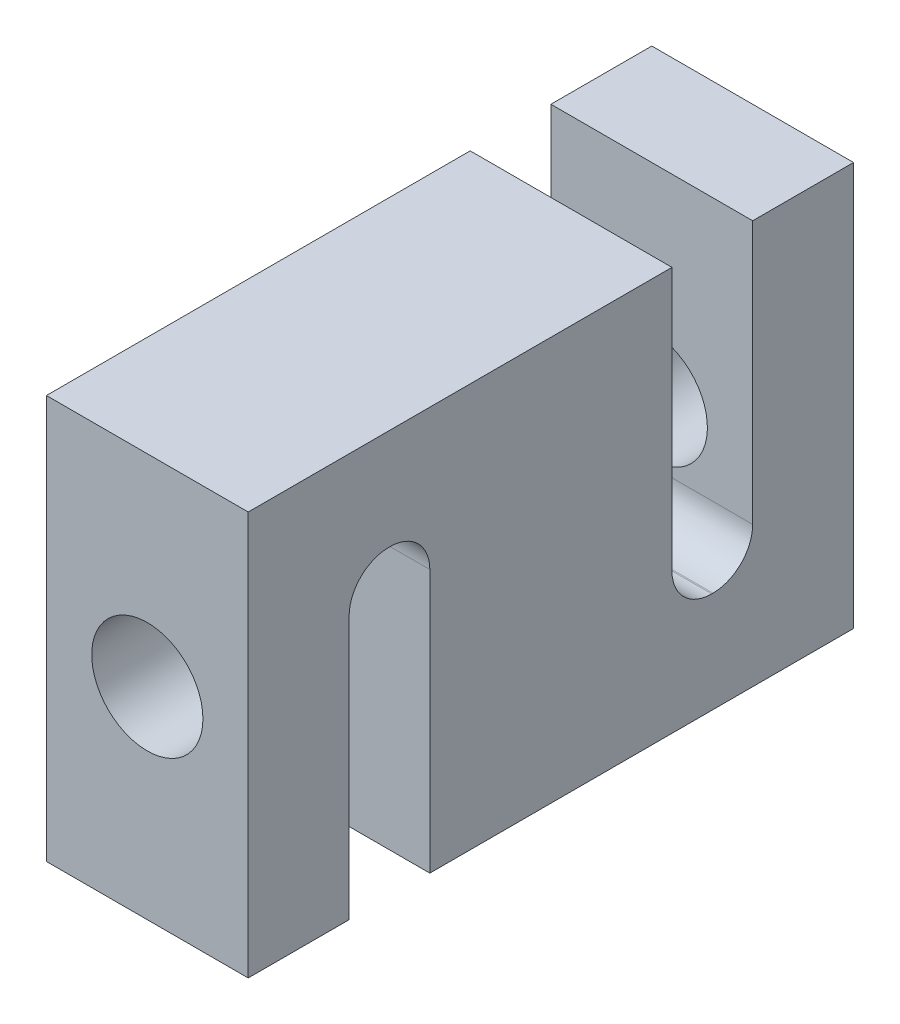
ISO-10303-21;
HEADER;
FILE_DESCRIPTION(('STEP AP214'),'2;1');
FILE_NAME('part.step','',(''),(''),'','','');
FILE_SCHEMA(('AUTOMOTIVE_DESIGN { 1 0 10303 214 1 1 1 1 }'));
ENDSEC;
DATA;
#1=APPLICATION_CONTEXT('core data for automotive mechanical design processes');
#2=APPLICATION_PROTOCOL_DEFINITION('international standard','automotive_design',2000,#1);
#3=PRODUCT_CONTEXT('',#1,'mechanical');
#4=PRODUCT('Part','Part','',(#3));
#5=PRODUCT_RELATED_PRODUCT_CATEGORY('part','',(#4));
#6=PRODUCT_DEFINITION_FORMATION('','',#4);
#7=PRODUCT_DEFINITION_CONTEXT('part definition',#1,'design');
#8=PRODUCT_DEFINITION('design','',#6,#7);
#9=PRODUCT_DEFINITION_SHAPE('','',#8);
#10=(LENGTH_UNIT() NAMED_UNIT(*) SI_UNIT(.MILLI.,.METRE.));
#11=(NAMED_UNIT(*) PLANE_ANGLE_UNIT() SI_UNIT($,.RADIAN.));
#12=(NAMED_UNIT(*) SI_UNIT($,.STERADIAN.) SOLID_ANGLE_UNIT());
#13=UNCERTAINTY_MEASURE_WITH_UNIT(LENGTH_MEASURE(1.E-05),#10,'distance_accuracy_value','');
#14=(GEOMETRIC_REPRESENTATION_CONTEXT(3) GLOBAL_UNCERTAINTY_ASSIGNED_CONTEXT((#13)) GLOBAL_UNIT_ASSIGNED_CONTEXT((#10,
#11,#12)) REPRESENTATION_CONTEXT('',''));
#15=CARTESIAN_POINT('',(0.,0.,0.));
#16=DIRECTION('',(0.,0.,1.));
#17=DIRECTION('',(1.,0.,0.));
#18=AXIS2_PLACEMENT_3D('',#15,#16,#17);
#19=CARTESIAN_POINT('',(0.,0.,76.2));
#20=DIRECTION('',(0.,0.,-1.));
#21=DIRECTION('',(-1.,0.,0.));
#22=AXIS2_PLACEMENT_3D('',#19,#20,#21);
#23=PLANE('',#22);
#24=DIRECTION('',(0.,-1.,0.));
#25=VECTOR('',#24,1.);
#26=CARTESIAN_POINT('',(-15.0442260230648,30.1202688679325,76.2));
#27=LINE('',#26,#25);
#28=CARTESIAN_POINT('',(-15.0442260230648,80.9202688679325,76.2));
#29=VERTEX_POINT('',#28);
#30=CARTESIAN_POINT('',(-15.0442260230648,30.1202688679325,76.2));
#31=VERTEX_POINT('',#30);
#32=EDGE_CURVE('E249',#29,#31,#27,.T.);
#33=ORIENTED_EDGE('',*,*,#32,.T.);
#34=DIRECTION('',(1.,0.,0.));
#35=VECTOR('',#34,1.);
#36=CARTESIAN_POINT('',(-15.0442260230648,30.1202688679325,76.2));
#37=LINE('',#36,#35);
#38=CARTESIAN_POINT('',(10.3557739769352,30.1202688679325,76.2));
#39=VERTEX_POINT('',#38);
#40=EDGE_CURVE('E252',#31,#39,#37,.T.);
#41=ORIENTED_EDGE('',*,*,#40,.T.);
#42=DIRECTION('',(0.,1.,0.));
#43=VECTOR('',#42,1.);
#44=CARTESIAN_POINT('',(10.3557739769352,30.1202688679325,76.2));
#45=LINE('',#44,#43);
#46=CARTESIAN_POINT('',(10.3557739769352,80.9202688679325,76.2));
#47=VERTEX_POINT('',#46);
#48=EDGE_CURVE('E255',#39,#47,#45,.T.);
#49=ORIENTED_EDGE('',*,*,#48,.T.);
#50=DIRECTION('',(-1.,0.,0.));
#51=VECTOR('',#50,1.);
#52=CARTESIAN_POINT('',(-15.0442260230648,80.9202688679325,76.2));
#53=LINE('',#52,#51);
#54=EDGE_CURVE('E177',#47,#29,#53,.T.);
#55=ORIENTED_EDGE('',*,*,#54,.T.);
#56=EDGE_LOOP('',(#33,#41,#49,#55));
#57=FACE_BOUND('',#56,.T.);
#58=CARTESIAN_POINT('',(-2.34422602306477,55.5202688679325,76.2));
#59=DIRECTION('',(0.,0.,1.));
#60=DIRECTION('',(1.,0.,0.));
#61=AXIS2_PLACEMENT_3D('',#58,#59,#60);
#62=CIRCLE('',#61,7.);
#63=CARTESIAN_POINT('',(4.65577397693523,55.5202688679325,76.2));
#64=VERTEX_POINT('',#63);
#65=EDGE_CURVE('E501',#64,#64,#62,.T.);
#66=ORIENTED_EDGE('',*,*,#65,.F.);
#67=EDGE_LOOP('',(#66));
#68=FACE_BOUND('',#67,.T.);
#69=ADVANCED_FACE('F39',(#57,#68),#23,.F.);
#70=CARTESIAN_POINT('',(-15.0442260230648,30.1202688679325,76.2));
#71=DIRECTION('',(0.,1.,0.));
#72=DIRECTION('',(0.,0.,1.));
#73=AXIS2_PLACEMENT_3D('',#70,#71,#72);
#74=PLANE('',#73);
#75=DIRECTION('',(0.,0.,-1.));
#76=VECTOR('',#75,1.);
#77=CARTESIAN_POINT('',(10.3557739769352,30.1202688679325,76.2));
#78=LINE('',#77,#76);
#79=CARTESIAN_POINT('',(10.3557739769352,30.1202688679325,53.34));
#80=VERTEX_POINT('',#79);
#81=CARTESIAN_POINT('',(10.3557739769352,30.1202688679325,0.));
#82=VERTEX_POINT('',#81);
#83=EDGE_CURVE('E178',#80,#82,#78,.T.);
#84=ORIENTED_EDGE('',*,*,#83,.F.);
#85=DIRECTION('',(-1.,0.,0.));
#86=VECTOR('',#85,1.);
#87=CARTESIAN_POINT('',(10.3557739769352,30.1202688679325,53.34));
#88=LINE('',#87,#86);
#89=CARTESIAN_POINT('',(-15.0442260230648,30.1202688679325,53.34));
#90=VERTEX_POINT('',#89);
#91=EDGE_CURVE('E240',#80,#90,#88,.T.);
#92=ORIENTED_EDGE('',*,*,#91,.T.);
#93=DIRECTION('',(0.,0.,-1.));
#94=VECTOR('',#93,1.);
#95=CARTESIAN_POINT('',(-15.0442260230648,30.1202688679325,76.2));
#96=LINE('',#95,#94);
#97=CARTESIAN_POINT('',(-15.0442260230648,30.1202688679325,0.));
#98=VERTEX_POINT('',#97);
#99=EDGE_CURVE('E188',#90,#98,#96,.T.);
#100=ORIENTED_EDGE('',*,*,#99,.T.);
#101=DIRECTION('',(1.,0.,0.));
#102=VECTOR('',#101,1.);
#103=CARTESIAN_POINT('',(-15.0442260230648,30.1202688679325,0.));
#104=LINE('',#103,#102);
#105=EDGE_CURVE('E262',#98,#82,#104,.T.);
#106=ORIENTED_EDGE('',*,*,#105,.T.);
#107=EDGE_LOOP('',(#84,#92,#100,#106));
#108=FACE_BOUND('',#107,.T.);
#109=ADVANCED_FACE('F322',(#108),#74,.F.);
#110=CARTESIAN_POINT('',(-15.0442260230648,80.9202688679325,76.2));
#111=DIRECTION('',(0.,-1.,0.));
#112=DIRECTION('',(0.,0.,-1.));
#113=AXIS2_PLACEMENT_3D('',#110,#111,#112);
#114=PLANE('',#113);
#115=DIRECTION('',(0.,0.,-1.));
#116=VECTOR('',#115,1.);
#117=CARTESIAN_POINT('',(-15.0442260230648,80.9202688679325,76.2));
#118=LINE('',#117,#116);
#119=CARTESIAN_POINT('',(-15.0442260230648,80.9202688679325,12.7));
#120=VERTEX_POINT('',#119);
#121=CARTESIAN_POINT('',(-15.0442260230648,80.9202688679325,0.));
#122=VERTEX_POINT('',#121);
#123=EDGE_CURVE('E258',#120,#122,#118,.T.);
#124=ORIENTED_EDGE('',*,*,#123,.F.);
#125=DIRECTION('',(-1.,0.,0.));
#126=VECTOR('',#125,1.);
#127=CARTESIAN_POINT('',(10.3557739769352,80.9202688679325,12.7));
#128=LINE('',#127,#126);
#129=CARTESIAN_POINT('',(10.3557739769352,80.9202688679325,12.7));
#130=VERTEX_POINT('',#129);
#131=EDGE_CURVE('E174',#130,#120,#128,.T.);
#132=ORIENTED_EDGE('',*,*,#131,.F.);
#133=DIRECTION('',(0.,0.,-1.));
#134=VECTOR('',#133,1.);
#135=CARTESIAN_POINT('',(10.3557739769352,80.9202688679325,76.2));
#136=LINE('',#135,#134);
#137=CARTESIAN_POINT('',(10.3557739769352,80.9202688679325,0.));
#138=VERTEX_POINT('',#137);
#139=EDGE_CURVE('E179',#130,#138,#136,.T.);
#140=ORIENTED_EDGE('',*,*,#139,.T.);
#141=DIRECTION('',(-1.,0.,0.));
#142=VECTOR('',#141,1.);
#143=CARTESIAN_POINT('',(-15.0442260230648,80.9202688679325,0.));
#144=LINE('',#143,#142);
#145=EDGE_CURVE('E253',#138,#122,#144,.T.);
#146=ORIENTED_EDGE('',*,*,#145,.T.);
#147=EDGE_LOOP('',(#124,#132,#140,#146));
#148=FACE_BOUND('',#147,.T.);
#149=ADVANCED_FACE('F272',(#148),#114,.F.);
#150=CARTESIAN_POINT('',(-15.0442260230648,30.1202688679325,76.2));
#151=DIRECTION('',(1.,0.,0.));
#152=DIRECTION('',(0.,0.,-1.));
#153=AXIS2_PLACEMENT_3D('',#150,#151,#152);
#154=PLANE('',#153);
#155=DIRECTION('',(0.,0.,1.));
#156=VECTOR('',#155,1.);
#157=CARTESIAN_POINT('',(-15.0442260230648,42.8202688679325,12.7));
#158=LINE('',#157,#156);
#159=CARTESIAN_POINT('',(-15.0442260230648,42.8202688679325,17.7));
#160=VERTEX_POINT('',#159);
#161=CARTESIAN_POINT('',(-15.0442260230648,42.8202688679325,17.86));
#162=VERTEX_POINT('',#161);
#163=EDGE_CURVE('E483',#160,#162,#158,.T.);
#164=ORIENTED_EDGE('',*,*,#163,.F.);
#165=CARTESIAN_POINT('',(-15.0442260230648,47.8202688679325,17.7));
#166=DIRECTION('',(1.,0.,0.));
#167=DIRECTION('',(0.,0.,-1.));
#168=AXIS2_PLACEMENT_3D('',#165,#166,#167);
#169=CIRCLE('',#168,5.);
#170=CARTESIAN_POINT('',(-15.0442260230648,47.8202688679325,12.7));
#171=VERTEX_POINT('',#170);
#172=EDGE_CURVE('E210',#160,#171,#169,.T.);
#173=ORIENTED_EDGE('',*,*,#172,.T.);
#174=DIRECTION('',(0.,-1.,0.));
#175=VECTOR('',#174,1.);
#176=CARTESIAN_POINT('',(-15.0442260230648,80.9202688679325,12.7));
#177=LINE('',#176,#175);
#178=EDGE_CURVE('E280',#120,#171,#177,.T.);
#179=ORIENTED_EDGE('',*,*,#178,.F.);
#180=ORIENTED_EDGE('',*,*,#123,.T.);
#181=DIRECTION('',(0.,-1.,0.));
#182=VECTOR('',#181,1.);
#183=CARTESIAN_POINT('',(-15.0442260230648,30.1202688679325,0.));
#184=LINE('',#183,#182);
#185=EDGE_CURVE('E259',#122,#98,#184,.T.);
#186=ORIENTED_EDGE('',*,*,#185,.T.);
#187=ORIENTED_EDGE('',*,*,#99,.F.);
#188=DIRECTION('',(0.,-1.,0.));
#189=VECTOR('',#188,1.);
#190=CARTESIAN_POINT('',(-15.0442260230648,30.1202688679325,53.34));
#191=LINE('',#190,#189);
#192=CARTESIAN_POINT('',(-15.0442260230648,63.2202688679325,53.34));
#193=VERTEX_POINT('',#192);
#194=EDGE_CURVE('E228',#193,#90,#191,.T.);
#195=ORIENTED_EDGE('',*,*,#194,.F.);
#196=CARTESIAN_POINT('',(-15.0442260230648,63.2202688679325,58.34));
#197=DIRECTION('',(1.,0.,0.));
#198=DIRECTION('',(0.,0.,-1.));
#199=AXIS2_PLACEMENT_3D('',#196,#197,#198);
#200=CIRCLE('',#199,5.);
#201=CARTESIAN_POINT('',(-15.0442260230648,68.2202688679325,58.34));
#202=VERTEX_POINT('',#201);
#203=EDGE_CURVE('E47',#193,#202,#200,.T.);
#204=ORIENTED_EDGE('',*,*,#203,.T.);
#205=DIRECTION('',(0.,0.,-1.));
#206=VECTOR('',#205,1.);
#207=CARTESIAN_POINT('',(-15.0442260230648,68.2202688679325,53.34));
#208=LINE('',#207,#206);
#209=CARTESIAN_POINT('',(-15.0442260230648,68.2202688679325,58.5));
#210=VERTEX_POINT('',#209);
#211=EDGE_CURVE('E226',#210,#202,#208,.T.);
#212=ORIENTED_EDGE('',*,*,#211,.F.);
#213=CARTESIAN_POINT('',(-15.0442260230648,63.2202688679325,58.5));
#214=DIRECTION('',(1.,0.,0.));
#215=DIRECTION('',(0.,0.,-1.));
#216=AXIS2_PLACEMENT_3D('',#213,#214,#215);
#217=CIRCLE('',#216,5.);
#218=CARTESIAN_POINT('',(-15.0442260230648,63.2202688679325,63.5));
#219=VERTEX_POINT('',#218);
#220=EDGE_CURVE('E217',#210,#219,#217,.T.);
#221=ORIENTED_EDGE('',*,*,#220,.T.);
#222=DIRECTION('',(0.,1.,0.));
#223=VECTOR('',#222,1.);
#224=CARTESIAN_POINT('',(-15.0442260230648,30.1202688679325,63.5));
#225=LINE('',#224,#223);
#226=CARTESIAN_POINT('',(-15.0442260230648,30.1202688679325,63.5));
#227=VERTEX_POINT('',#226);
#228=EDGE_CURVE('E233',#227,#219,#225,.T.);
#229=ORIENTED_EDGE('',*,*,#228,.F.);
#230=EDGE_CURVE('E189',#31,#227,#96,.T.);
#231=ORIENTED_EDGE('',*,*,#230,.F.);
#232=ORIENTED_EDGE('',*,*,#32,.F.);
#233=CARTESIAN_POINT('',(-15.0442260230648,80.9202688679325,22.86));
#234=VERTEX_POINT('',#233);
#235=EDGE_CURVE('E183',#29,#234,#118,.T.);
#236=ORIENTED_EDGE('',*,*,#235,.T.);
#237=DIRECTION('',(0.,1.,0.));
#238=VECTOR('',#237,1.);
#239=CARTESIAN_POINT('',(-15.0442260230648,80.9202688679325,22.86));
#240=LINE('',#239,#238);
#241=CARTESIAN_POINT('',(-15.0442260230648,47.8202688679325,22.86));
#242=VERTEX_POINT('',#241);
#243=EDGE_CURVE('E170',#242,#234,#240,.T.);
#244=ORIENTED_EDGE('',*,*,#243,.F.);
#245=CARTESIAN_POINT('',(-15.0442260230648,47.8202688679325,17.86));
#246=DIRECTION('',(1.,0.,0.));
#247=DIRECTION('',(0.,0.,-1.));
#248=AXIS2_PLACEMENT_3D('',#245,#246,#247);
#249=CIRCLE('',#248,5.);
#250=EDGE_CURVE('E214',#242,#162,#249,.T.);
#251=ORIENTED_EDGE('',*,*,#250,.T.);
#252=EDGE_LOOP('',(#164,#173,#179,#180,#186,#187,#195,#204,#212,#221,#229,#231,#232,#236,#244,#251));
#253=FACE_BOUND('',#252,.T.);
#254=ADVANCED_FACE('F225',(#253),#154,.F.);
#255=ORIENTED_EDGE('',*,*,#230,.T.);
#256=DIRECTION('',(-1.,0.,0.));
#257=VECTOR('',#256,1.);
#258=CARTESIAN_POINT('',(10.3557739769352,30.1202688679325,63.5));
#259=LINE('',#258,#257);
#260=CARTESIAN_POINT('',(10.3557739769352,30.1202688679325,63.5));
#261=VERTEX_POINT('',#260);
#262=EDGE_CURVE('E291',#261,#227,#259,.T.);
#263=ORIENTED_EDGE('',*,*,#262,.F.);
#264=EDGE_CURVE('E181',#39,#261,#78,.T.);
#265=ORIENTED_EDGE('',*,*,#264,.F.);
#266=ORIENTED_EDGE('',*,*,#40,.F.);
#267=EDGE_LOOP('',(#255,#263,#265,#266));
#268=FACE_BOUND('',#267,.T.);
#269=ADVANCED_FACE('F290',(#268),#74,.F.);
#270=CARTESIAN_POINT('',(10.3557739769352,30.1202688679325,76.2));
#271=DIRECTION('',(-1.,0.,0.));
#272=DIRECTION('',(0.,0.,1.));
#273=AXIS2_PLACEMENT_3D('',#270,#271,#272);
#274=PLANE('',#273);
#275=ORIENTED_EDGE('',*,*,#139,.F.);
#276=DIRECTION('',(0.,-1.,0.));
#277=VECTOR('',#276,1.);
#278=CARTESIAN_POINT('',(10.3557739769352,80.9202688679325,12.7));
#279=LINE('',#278,#277);
#280=CARTESIAN_POINT('',(10.3557739769352,47.8202688679325,12.7));
#281=VERTEX_POINT('',#280);
#282=EDGE_CURVE('E488',#130,#281,#279,.T.);
#283=ORIENTED_EDGE('',*,*,#282,.T.);
#284=CARTESIAN_POINT('',(10.3557739769352,47.8202688679325,17.7));
#285=DIRECTION('',(-1.,0.,0.));
#286=DIRECTION('',(0.,0.,1.));
#287=AXIS2_PLACEMENT_3D('',#284,#285,#286);
#288=CIRCLE('',#287,5.);
#289=CARTESIAN_POINT('',(10.3557739769352,42.8202688679325,17.7));
#290=VERTEX_POINT('',#289);
#291=EDGE_CURVE('E212',#281,#290,#288,.T.);
#292=ORIENTED_EDGE('',*,*,#291,.T.);
#293=DIRECTION('',(0.,0.,1.));
#294=VECTOR('',#293,1.);
#295=CARTESIAN_POINT('',(10.3557739769352,42.8202688679325,12.7));
#296=LINE('',#295,#294);
#297=CARTESIAN_POINT('',(10.3557739769352,42.8202688679325,17.86));
#298=VERTEX_POINT('',#297);
#299=EDGE_CURVE('E165',#290,#298,#296,.T.);
#300=ORIENTED_EDGE('',*,*,#299,.T.);
#301=CARTESIAN_POINT('',(10.3557739769352,47.8202688679325,17.86));
#302=DIRECTION('',(-1.,0.,0.));
#303=DIRECTION('',(0.,0.,1.));
#304=AXIS2_PLACEMENT_3D('',#301,#302,#303);
#305=CIRCLE('',#304,5.);
#306=CARTESIAN_POINT('',(10.3557739769352,47.8202688679325,22.86));
#307=VERTEX_POINT('',#306);
#308=EDGE_CURVE('E160',#298,#307,#305,.T.);
#309=ORIENTED_EDGE('',*,*,#308,.T.);
#310=DIRECTION('',(0.,1.,0.));
#311=VECTOR('',#310,1.);
#312=CARTESIAN_POINT('',(10.3557739769352,80.9202688679325,22.86));
#313=LINE('',#312,#311);
#314=CARTESIAN_POINT('',(10.3557739769352,80.9202688679325,22.86));
#315=VERTEX_POINT('',#314);
#316=EDGE_CURVE('E150',#307,#315,#313,.T.);
#317=ORIENTED_EDGE('',*,*,#316,.T.);
#318=EDGE_CURVE('E156',#47,#315,#136,.T.);
#319=ORIENTED_EDGE('',*,*,#318,.F.);
#320=ORIENTED_EDGE('',*,*,#48,.F.);
#321=ORIENTED_EDGE('',*,*,#264,.T.);
#322=DIRECTION('',(0.,1.,0.));
#323=VECTOR('',#322,1.);
#324=CARTESIAN_POINT('',(10.3557739769352,30.1202688679325,63.5));
#325=LINE('',#324,#323);
#326=CARTESIAN_POINT('',(10.3557739769352,63.2202688679325,63.5));
#327=VERTEX_POINT('',#326);
#328=EDGE_CURVE('E242',#261,#327,#325,.T.);
#329=ORIENTED_EDGE('',*,*,#328,.T.);
#330=CARTESIAN_POINT('',(10.3557739769352,63.2202688679325,58.5));
#331=DIRECTION('',(-1.,0.,0.));
#332=DIRECTION('',(0.,0.,1.));
#333=AXIS2_PLACEMENT_3D('',#330,#331,#332);
#334=CIRCLE('',#333,5.);
#335=CARTESIAN_POINT('',(10.3557739769352,68.2202688679325,58.5));
#336=VERTEX_POINT('',#335);
#337=EDGE_CURVE('E219',#327,#336,#334,.T.);
#338=ORIENTED_EDGE('',*,*,#337,.T.);
#339=DIRECTION('',(0.,0.,-1.));
#340=VECTOR('',#339,1.);
#341=CARTESIAN_POINT('',(10.3557739769352,68.2202688679325,53.34));
#342=LINE('',#341,#340);
#343=CARTESIAN_POINT('',(10.3557739769352,68.2202688679325,58.34));
#344=VERTEX_POINT('',#343);
#345=EDGE_CURVE('E245',#336,#344,#342,.T.);
#346=ORIENTED_EDGE('',*,*,#345,.T.);
#347=CARTESIAN_POINT('',(10.3557739769352,63.2202688679325,58.34));
#348=DIRECTION('',(-1.,0.,0.));
#349=DIRECTION('',(0.,0.,1.));
#350=AXIS2_PLACEMENT_3D('',#347,#348,#349);
#351=CIRCLE('',#350,5.);
#352=CARTESIAN_POINT('',(10.3557739769352,63.2202688679325,53.34));
#353=VERTEX_POINT('',#352);
#354=EDGE_CURVE('E11',#344,#353,#351,.T.);
#355=ORIENTED_EDGE('',*,*,#354,.T.);
#356=DIRECTION('',(0.,-1.,0.));
#357=VECTOR('',#356,1.);
#358=CARTESIAN_POINT('',(10.3557739769352,30.1202688679325,53.34));
#359=LINE('',#358,#357);
#360=EDGE_CURVE('E234',#353,#80,#359,.T.);
#361=ORIENTED_EDGE('',*,*,#360,.T.);
#362=ORIENTED_EDGE('',*,*,#83,.T.);
#363=DIRECTION('',(0.,1.,0.));
#364=VECTOR('',#363,1.);
#365=CARTESIAN_POINT('',(10.3557739769352,30.1202688679325,0.));
#366=LINE('',#365,#364);
#367=EDGE_CURVE('E265',#82,#138,#366,.T.);
#368=ORIENTED_EDGE('',*,*,#367,.T.);
#369=EDGE_LOOP('',(#275,#283,#292,#300,#309,#317,#319,#320,#321,#329,#338,#346,#355,#361,#362,#368));
#370=FACE_BOUND('',#369,.T.);
#371=ADVANCED_FACE('F153',(#370),#274,.F.);
#372=ORIENTED_EDGE('',*,*,#318,.T.);
#373=DIRECTION('',(-1.,0.,0.));
#374=VECTOR('',#373,1.);
#375=CARTESIAN_POINT('',(10.3557739769352,80.9202688679325,22.86));
#376=LINE('',#375,#374);
#377=EDGE_CURVE('E164',#315,#234,#376,.T.);
#378=ORIENTED_EDGE('',*,*,#377,.T.);
#379=ORIENTED_EDGE('',*,*,#235,.F.);
#380=ORIENTED_EDGE('',*,*,#54,.F.);
#381=EDGE_LOOP('',(#372,#378,#379,#380));
#382=FACE_BOUND('',#381,.T.);
#383=ADVANCED_FACE('F176',(#382),#114,.F.);
#384=CARTESIAN_POINT('',(0.,0.,0.));
#385=DIRECTION('',(0.,0.,-1.));
#386=DIRECTION('',(-1.,0.,0.));
#387=AXIS2_PLACEMENT_3D('',#384,#385,#386);
#388=PLANE('',#387);
#389=CARTESIAN_POINT('',(-2.34422602306477,55.5202688679325,0.));
#390=DIRECTION('',(0.,0.,-1.));
#391=DIRECTION('',(-1.,0.,0.));
#392=AXIS2_PLACEMENT_3D('',#389,#390,#391);
#393=CIRCLE('',#392,7.);
#394=CARTESIAN_POINT('',(-9.34422602306476,55.5202688679325,0.));
#395=VERTEX_POINT('',#394);
#396=EDGE_CURVE('E298',#395,#395,#393,.T.);
#397=ORIENTED_EDGE('',*,*,#396,.F.);
#398=EDGE_LOOP('',(#397));
#399=FACE_BOUND('',#398,.T.);
#400=ORIENTED_EDGE('',*,*,#185,.F.);
#401=ORIENTED_EDGE('',*,*,#145,.F.);
#402=ORIENTED_EDGE('',*,*,#367,.F.);
#403=ORIENTED_EDGE('',*,*,#105,.F.);
#404=EDGE_LOOP('',(#400,#401,#402,#403));
#405=FACE_BOUND('',#404,.T.);
#406=ADVANCED_FACE('F277',(#399,#405),#388,.T.);
#407=CARTESIAN_POINT('',(10.3557739769352,80.9202688679325,12.7));
#408=DIRECTION('',(0.,0.,-1.));
#409=DIRECTION('',(0.,1.,0.));
#410=AXIS2_PLACEMENT_3D('',#407,#408,#409);
#411=PLANE('',#410);
#412=CARTESIAN_POINT('',(-2.34422602306477,55.5202688679325,12.7));
#413=DIRECTION('',(0.,0.,-1.));
#414=DIRECTION('',(0.,1.,0.));
#415=AXIS2_PLACEMENT_3D('',#412,#413,#414);
#416=CIRCLE('',#415,7.);
#417=CARTESIAN_POINT('',(-2.34422602306477,62.5202688679325,12.7));
#418=VERTEX_POINT('',#417);
#419=EDGE_CURVE('E294',#418,#418,#416,.T.);
#420=ORIENTED_EDGE('',*,*,#419,.T.);
#421=EDGE_LOOP('',(#420));
#422=FACE_BOUND('',#421,.T.);
#423=ORIENTED_EDGE('',*,*,#178,.T.);
#424=DIRECTION('',(-1.,0.,0.));
#425=VECTOR('',#424,1.);
#426=CARTESIAN_POINT('',(10.3557739769352,47.8202688679325,12.7));
#427=LINE('',#426,#425);
#428=EDGE_CURVE('E197',#171,#281,#427,.F.);
#429=ORIENTED_EDGE('',*,*,#428,.T.);
#430=ORIENTED_EDGE('',*,*,#282,.F.);
#431=ORIENTED_EDGE('',*,*,#131,.T.);
#432=EDGE_LOOP('',(#423,#429,#430,#431));
#433=FACE_BOUND('',#432,.T.);
#434=ADVANCED_FACE('F333',(#422,#433),#411,.F.);
#435=CARTESIAN_POINT('',(10.3557739769352,80.9202688679325,22.86));
#436=DIRECTION('',(0.,0.,1.));
#437=DIRECTION('',(0.,-1.,0.));
#438=AXIS2_PLACEMENT_3D('',#435,#436,#437);
#439=PLANE('',#438);
#440=ORIENTED_EDGE('',*,*,#316,.F.);
#441=DIRECTION('',(-1.,0.,0.));
#442=VECTOR('',#441,1.);
#443=CARTESIAN_POINT('',(-15.0442260230648,47.8202688679325,22.86));
#444=LINE('',#443,#442);
#445=EDGE_CURVE('E199',#307,#242,#444,.T.);
#446=ORIENTED_EDGE('',*,*,#445,.T.);
#447=ORIENTED_EDGE('',*,*,#243,.T.);
#448=ORIENTED_EDGE('',*,*,#377,.F.);
#449=EDGE_LOOP('',(#440,#446,#447,#448));
#450=FACE_BOUND('',#449,.T.);
#451=ADVANCED_FACE('F168',(#450),#439,.F.);
#452=CARTESIAN_POINT('',(10.3557739769352,42.8202688679325,12.7));
#453=DIRECTION('',(0.,-1.,0.));
#454=DIRECTION('',(0.,0.,-1.));
#455=AXIS2_PLACEMENT_3D('',#452,#453,#454);
#456=PLANE('',#455);
#457=ORIENTED_EDGE('',*,*,#299,.F.);
#458=DIRECTION('',(-1.,0.,0.));
#459=VECTOR('',#458,1.);
#460=CARTESIAN_POINT('',(-15.0442260230648,42.8202688679325,17.7));
#461=LINE('',#460,#459);
#462=EDGE_CURVE('E194',#290,#160,#461,.T.);
#463=ORIENTED_EDGE('',*,*,#462,.T.);
#464=ORIENTED_EDGE('',*,*,#163,.T.);
#465=DIRECTION('',(-1.,0.,0.));
#466=VECTOR('',#465,1.);
#467=CARTESIAN_POINT('',(10.3557739769352,42.8202688679325,17.86));
#468=LINE('',#467,#466);
#469=EDGE_CURVE('E192',#162,#298,#468,.F.);
#470=ORIENTED_EDGE('',*,*,#469,.T.);
#471=EDGE_LOOP('',(#457,#463,#464,#470));
#472=FACE_BOUND('',#471,.T.);
#473=ADVANCED_FACE('F408',(#472),#456,.F.);
#474=CARTESIAN_POINT('',(10.3557739769352,30.1202688679325,53.34));
#475=DIRECTION('',(0.,0.,-1.));
#476=DIRECTION('',(-1.,0.,0.));
#477=AXIS2_PLACEMENT_3D('',#474,#475,#476);
#478=PLANE('',#477);
#479=ORIENTED_EDGE('',*,*,#360,.F.);
#480=DIRECTION('',(-1.,0.,0.));
#481=VECTOR('',#480,1.);
#482=CARTESIAN_POINT('',(-15.0442260230648,63.2202688679325,53.34));
#483=LINE('',#482,#481);
#484=EDGE_CURVE('E208',#353,#193,#483,.T.);
#485=ORIENTED_EDGE('',*,*,#484,.T.);
#486=ORIENTED_EDGE('',*,*,#194,.T.);
#487=ORIENTED_EDGE('',*,*,#91,.F.);
#488=EDGE_LOOP('',(#479,#485,#486,#487));
#489=FACE_BOUND('',#488,.T.);
#490=ADVANCED_FACE('F237',(#489),#478,.F.);
#491=CARTESIAN_POINT('',(10.3557739769352,68.2202688679325,53.34));
#492=DIRECTION('',(0.,1.,0.));
#493=DIRECTION('',(0.,0.,1.));
#494=AXIS2_PLACEMENT_3D('',#491,#492,#493);
#495=PLANE('',#494);
#496=ORIENTED_EDGE('',*,*,#345,.F.);
#497=DIRECTION('',(-1.,0.,0.));
#498=VECTOR('',#497,1.);
#499=CARTESIAN_POINT('',(-15.0442260230648,68.2202688679325,58.5));
#500=LINE('',#499,#498);
#501=EDGE_CURVE('E203',#336,#210,#500,.T.);
#502=ORIENTED_EDGE('',*,*,#501,.T.);
#503=ORIENTED_EDGE('',*,*,#211,.T.);
#504=DIRECTION('',(-1.,0.,0.));
#505=VECTOR('',#504,1.);
#506=CARTESIAN_POINT('',(10.3557739769352,68.2202688679325,58.34));
#507=LINE('',#506,#505);
#508=EDGE_CURVE('E201',#202,#344,#507,.F.);
#509=ORIENTED_EDGE('',*,*,#508,.T.);
#510=EDGE_LOOP('',(#496,#502,#503,#509));
#511=FACE_BOUND('',#510,.T.);
#512=ADVANCED_FACE('F231',(#511),#495,.F.);
#513=CARTESIAN_POINT('',(10.3557739769352,30.1202688679325,63.5));
#514=DIRECTION('',(0.,0.,1.));
#515=DIRECTION('',(1.,0.,0.));
#516=AXIS2_PLACEMENT_3D('',#513,#514,#515);
#517=PLANE('',#516);
#518=CARTESIAN_POINT('',(-2.34422602306477,55.5202688679325,63.5));
#519=DIRECTION('',(0.,0.,1.));
#520=DIRECTION('',(1.,0.,0.));
#521=AXIS2_PLACEMENT_3D('',#518,#519,#520);
#522=CIRCLE('',#521,7.);
#523=CARTESIAN_POINT('',(4.65577397693523,55.5202688679325,63.5));
#524=VERTEX_POINT('',#523);
#525=EDGE_CURVE('E499',#524,#524,#522,.T.);
#526=ORIENTED_EDGE('',*,*,#525,.T.);
#527=EDGE_LOOP('',(#526));
#528=FACE_BOUND('',#527,.T.);
#529=ORIENTED_EDGE('',*,*,#228,.T.);
#530=DIRECTION('',(-1.,0.,0.));
#531=VECTOR('',#530,1.);
#532=CARTESIAN_POINT('',(10.3557739769352,63.2202688679325,63.5));
#533=LINE('',#532,#531);
#534=EDGE_CURVE('E206',#219,#327,#533,.F.);
#535=ORIENTED_EDGE('',*,*,#534,.T.);
#536=ORIENTED_EDGE('',*,*,#328,.F.);
#537=ORIENTED_EDGE('',*,*,#262,.T.);
#538=EDGE_LOOP('',(#529,#535,#536,#537));
#539=FACE_BOUND('',#538,.T.);
#540=ADVANCED_FACE('F305',(#528,#539),#517,.F.);
#541=CARTESIAN_POINT('',(-2.34422602306477,55.5202688679325,0.));
#542=DIRECTION('',(0.,0.,-1.));
#543=DIRECTION('',(-1.,0.,0.));
#544=AXIS2_PLACEMENT_3D('',#541,#542,#543);
#545=CYLINDRICAL_SURFACE('',#544,7.);
#546=ORIENTED_EDGE('',*,*,#419,.F.);
#547=EDGE_LOOP('',(#546));
#548=FACE_BOUND('',#547,.T.);
#549=ORIENTED_EDGE('',*,*,#396,.T.);
#550=EDGE_LOOP('',(#549));
#551=FACE_BOUND('',#550,.T.);
#552=ADVANCED_FACE('F307',(#548,#551),#545,.F.);
#553=CARTESIAN_POINT('',(-2.34422602306477,55.5202688679325,76.2));
#554=DIRECTION('',(0.,0.,1.));
#555=DIRECTION('',(1.,0.,0.));
#556=AXIS2_PLACEMENT_3D('',#553,#554,#555);
#557=CYLINDRICAL_SURFACE('',#556,7.);
#558=ORIENTED_EDGE('',*,*,#525,.F.);
#559=EDGE_LOOP('',(#558));
#560=FACE_BOUND('',#559,.T.);
#561=ORIENTED_EDGE('',*,*,#65,.T.);
#562=EDGE_LOOP('',(#561));
#563=FACE_BOUND('',#562,.T.);
#564=ADVANCED_FACE('F315',(#560,#563),#557,.F.);
#565=CARTESIAN_POINT('',(10.3557739769352,47.8202688679325,17.7));
#566=DIRECTION('',(1.,0.,0.));
#567=DIRECTION('',(0.,0.,-1.));
#568=AXIS2_PLACEMENT_3D('',#565,#566,#567);
#569=CYLINDRICAL_SURFACE('',#568,5.);
#570=ORIENTED_EDGE('',*,*,#291,.F.);
#571=ORIENTED_EDGE('',*,*,#428,.F.);
#572=ORIENTED_EDGE('',*,*,#172,.F.);
#573=ORIENTED_EDGE('',*,*,#462,.F.);
#574=EDGE_LOOP('',(#570,#571,#572,#573));
#575=FACE_BOUND('',#574,.T.);
#576=ADVANCED_FACE('F342',(#575),#569,.F.);
#577=CARTESIAN_POINT('',(10.3557739769352,47.8202688679325,17.86));
#578=DIRECTION('',(1.,0.,0.));
#579=DIRECTION('',(0.,0.,-1.));
#580=AXIS2_PLACEMENT_3D('',#577,#578,#579);
#581=CYLINDRICAL_SURFACE('',#580,5.);
#582=ORIENTED_EDGE('',*,*,#308,.F.);
#583=ORIENTED_EDGE('',*,*,#469,.F.);
#584=ORIENTED_EDGE('',*,*,#250,.F.);
#585=ORIENTED_EDGE('',*,*,#445,.F.);
#586=EDGE_LOOP('',(#582,#583,#584,#585));
#587=FACE_BOUND('',#586,.T.);
#588=ADVANCED_FACE('F344',(#587),#581,.F.);
#589=CARTESIAN_POINT('',(10.3557739769352,63.2202688679325,58.5));
#590=DIRECTION('',(1.,0.,0.));
#591=DIRECTION('',(0.,0.,-1.));
#592=AXIS2_PLACEMENT_3D('',#589,#590,#591);
#593=CYLINDRICAL_SURFACE('',#592,5.);
#594=ORIENTED_EDGE('',*,*,#337,.F.);
#595=ORIENTED_EDGE('',*,*,#534,.F.);
#596=ORIENTED_EDGE('',*,*,#220,.F.);
#597=ORIENTED_EDGE('',*,*,#501,.F.);
#598=EDGE_LOOP('',(#594,#595,#596,#597));
#599=FACE_BOUND('',#598,.T.);
#600=ADVANCED_FACE('F303',(#599),#593,.F.);
#601=CARTESIAN_POINT('',(10.3557739769352,63.2202688679325,58.34));
#602=DIRECTION('',(1.,0.,0.));
#603=DIRECTION('',(0.,0.,-1.));
#604=AXIS2_PLACEMENT_3D('',#601,#602,#603);
#605=CYLINDRICAL_SURFACE('',#604,5.);
#606=ORIENTED_EDGE('',*,*,#354,.F.);
#607=ORIENTED_EDGE('',*,*,#508,.F.);
#608=ORIENTED_EDGE('',*,*,#203,.F.);
#609=ORIENTED_EDGE('',*,*,#484,.F.);
#610=EDGE_LOOP('',(#606,#607,#608,#609));
#611=FACE_BOUND('',#610,.T.);
#612=ADVANCED_FACE('F41',(#611),#605,.F.);
#613=CLOSED_SHELL('',(#69,#109,#149,#254,#269,#371,#383,#406,#434,#451,#473,#490,#512,#540,#552,
#564,#576,#588,#600,#612));
#614=MANIFOLD_SOLID_BREP('B2',#613);
#615=ADVANCED_BREP_SHAPE_REPRESENTATION('',(#18,#614),#14);
#616=SHAPE_DEFINITION_REPRESENTATION(#9,#615);
ENDSEC;
END-ISO-10303-21;
